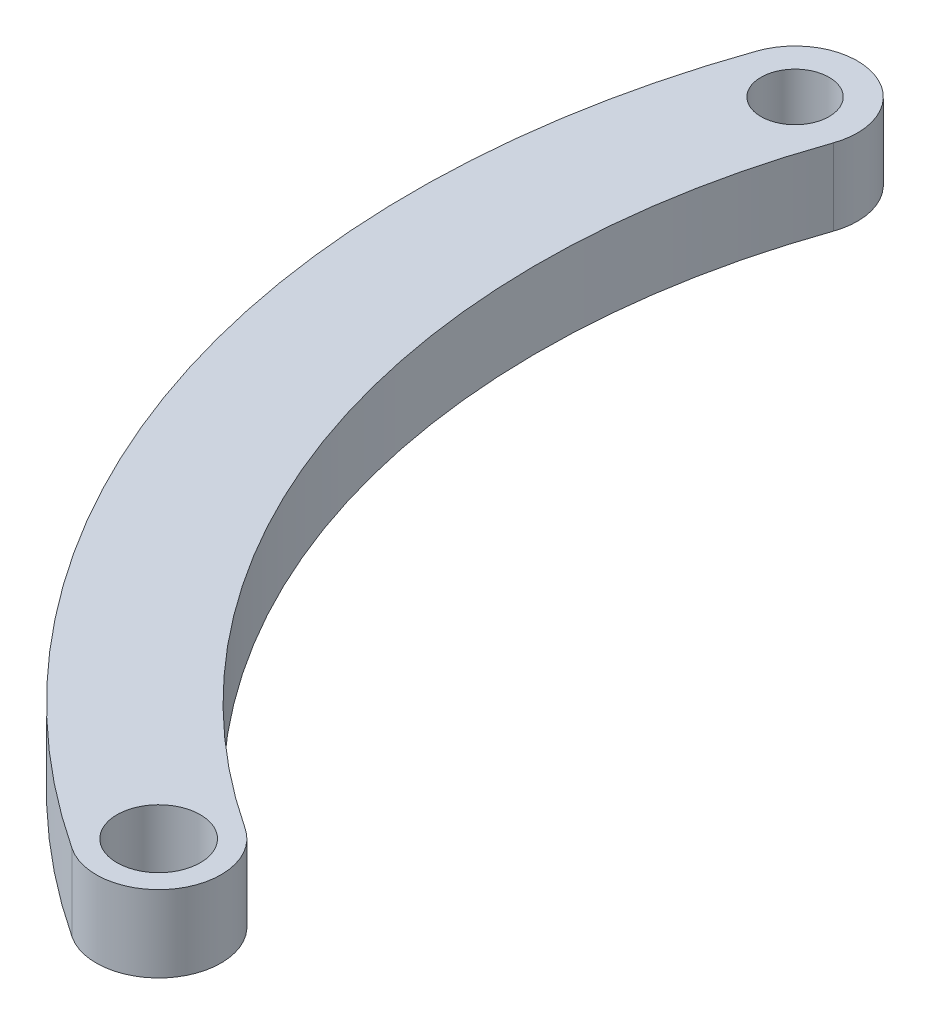
ISO-10303-21;
HEADER;
FILE_DESCRIPTION(('STEP AP214'),'2;1');
FILE_NAME('part.step','',(''),(''),'','','');
FILE_SCHEMA(('AUTOMOTIVE_DESIGN { 1 0 10303 214 1 1 1 1 }'));
ENDSEC;
DATA;
#1=APPLICATION_CONTEXT('core data for automotive mechanical design processes');
#2=APPLICATION_PROTOCOL_DEFINITION('international standard','automotive_design',2000,#1);
#3=PRODUCT_CONTEXT('',#1,'mechanical');
#4=PRODUCT('Part','Part','',(#3));
#5=PRODUCT_RELATED_PRODUCT_CATEGORY('part','',(#4));
#6=PRODUCT_DEFINITION_FORMATION('','',#4);
#7=PRODUCT_DEFINITION_CONTEXT('part definition',#1,'design');
#8=PRODUCT_DEFINITION('design','',#6,#7);
#9=PRODUCT_DEFINITION_SHAPE('','',#8);
#10=(LENGTH_UNIT() NAMED_UNIT(*) SI_UNIT(.MILLI.,.METRE.));
#11=(NAMED_UNIT(*) PLANE_ANGLE_UNIT() SI_UNIT($,.RADIAN.));
#12=(NAMED_UNIT(*) SI_UNIT($,.STERADIAN.) SOLID_ANGLE_UNIT());
#13=UNCERTAINTY_MEASURE_WITH_UNIT(LENGTH_MEASURE(1.E-05),#10,'distance_accuracy_value','');
#14=(GEOMETRIC_REPRESENTATION_CONTEXT(3) GLOBAL_UNCERTAINTY_ASSIGNED_CONTEXT((#13)) GLOBAL_UNIT_ASSIGNED_CONTEXT((#10,
#11,#12)) REPRESENTATION_CONTEXT('',''));
#15=CARTESIAN_POINT('',(0.,0.,0.));
#16=DIRECTION('',(0.,0.,1.));
#17=DIRECTION('',(1.,0.,0.));
#18=AXIS2_PLACEMENT_3D('',#15,#16,#17);
#19=CARTESIAN_POINT('',(-30.4740283959686,6.,-10.6886517508248));
#20=DIRECTION('',(0.,1.,0.));
#21=DIRECTION('',(0.,0.,1.));
#22=AXIS2_PLACEMENT_3D('',#19,#20,#21);
#23=PLANE('',#22);
#24=CARTESIAN_POINT('',(-60.9480567919372,6.,-21.3773035016496));
#25=DIRECTION('',(0.,1.,0.));
#26=DIRECTION('',(0.,0.,1.));
#27=AXIS2_PLACEMENT_3D('',#24,#25,#26);
#28=CIRCLE('',#27,2.67188870642774);
#29=CARTESIAN_POINT('',(-60.9480567919372,6.,-18.7054147952219));
#30=VERTEX_POINT('',#29);
#31=EDGE_CURVE('E100',#30,#30,#28,.T.);
#32=ORIENTED_EDGE('',*,*,#31,.F.);
#33=EDGE_LOOP('',(#32));
#34=FACE_BOUND('',#33,.T.);
#35=CARTESIAN_POINT('',(-60.9480567919372,6.,-21.3773035016496));
#36=DIRECTION('',(0.,1.,0.));
#37=DIRECTION('',(0.,0.,1.));
#38=AXIS2_PLACEMENT_3D('',#35,#36,#37);
#39=CIRCLE('',#38,4.89345326894357);
#40=CARTESIAN_POINT('',(-56.3304055320456,6.,-19.7576795522847));
#41=VERTEX_POINT('',#40);
#42=CARTESIAN_POINT('',(-65.5657080518287,6.,-22.9969274510146));
#43=VERTEX_POINT('',#42);
#44=EDGE_CURVE('E85',#41,#43,#39,.T.);
#45=ORIENTED_EDGE('',*,*,#44,.T.);
#46=CARTESIAN_POINT('',(0.,6.,0.));
#47=DIRECTION('',(0.,1.,0.));
#48=DIRECTION('',(0.,0.,1.));
#49=AXIS2_PLACEMENT_3D('',#46,#47,#48);
#50=CIRCLE('',#49,69.4818015348254);
#51=CARTESIAN_POINT('',(-38.2196310369916,6.,58.0256886897613));
#52=VERTEX_POINT('',#51);
#53=EDGE_CURVE('E80',#43,#52,#50,.T.);
#54=ORIENTED_EDGE('',*,*,#53,.T.);
#55=CARTESIAN_POINT('',(-35.5279049403094,6.,53.9390647144273));
#56=DIRECTION('',(0.,1.,0.));
#57=DIRECTION('',(0.,0.,1.));
#58=AXIS2_PLACEMENT_3D('',#55,#56,#57);
#59=CIRCLE('',#58,4.89345326894357);
#60=CARTESIAN_POINT('',(-32.8361788436272,6.,49.8524407390934));
#61=VERTEX_POINT('',#60);
#62=EDGE_CURVE('E83',#52,#61,#59,.T.);
#63=ORIENTED_EDGE('',*,*,#62,.T.);
#64=CARTESIAN_POINT('',(0.,6.,0.));
#65=DIRECTION('',(0.,-1.,0.));
#66=DIRECTION('',(0.,0.,1.));
#67=AXIS2_PLACEMENT_3D('',#64,#65,#66);
#68=CIRCLE('',#67,59.6948949969383);
#69=EDGE_CURVE('E50',#61,#41,#68,.T.);
#70=ORIENTED_EDGE('',*,*,#69,.T.);
#71=EDGE_LOOP('',(#45,#54,#63,#70));
#72=FACE_BOUND('',#71,.T.);
#73=CARTESIAN_POINT('',(-35.5279049403094,6.,53.9390647144273));
#74=DIRECTION('',(0.,1.,0.));
#75=DIRECTION('',(0.,0.,1.));
#76=AXIS2_PLACEMENT_3D('',#73,#74,#75);
#77=CIRCLE('',#76,3.265770333359);
#78=CARTESIAN_POINT('',(-35.5279049403094,6.,57.2048350477863));
#79=VERTEX_POINT('',#78);
#80=EDGE_CURVE('E115',#79,#79,#77,.T.);
#81=ORIENTED_EDGE('',*,*,#80,.F.);
#82=EDGE_LOOP('',(#81));
#83=FACE_BOUND('',#82,.T.);
#84=ADVANCED_FACE('F33',(#34,#72,#83),#23,.T.);
#85=CARTESIAN_POINT('',(-30.4740283959686,0.,-10.6886517508248));
#86=DIRECTION('',(0.,1.,0.));
#87=DIRECTION('',(0.,0.,1.));
#88=AXIS2_PLACEMENT_3D('',#85,#86,#87);
#89=PLANE('',#88);
#90=CARTESIAN_POINT('',(-60.9480567919372,0.,-21.3773035016496));
#91=DIRECTION('',(0.,1.,0.));
#92=DIRECTION('',(0.,0.,1.));
#93=AXIS2_PLACEMENT_3D('',#90,#91,#92);
#94=CIRCLE('',#93,2.67188870642774);
#95=CARTESIAN_POINT('',(-60.9480567919372,0.,-18.7054147952219));
#96=VERTEX_POINT('',#95);
#97=EDGE_CURVE('E112',#96,#96,#94,.T.);
#98=ORIENTED_EDGE('',*,*,#97,.T.);
#99=EDGE_LOOP('',(#98));
#100=FACE_BOUND('',#99,.T.);
#101=CARTESIAN_POINT('',(-60.9480567919372,0.,-21.3773035016496));
#102=DIRECTION('',(0.,1.,0.));
#103=DIRECTION('',(0.,0.,1.));
#104=AXIS2_PLACEMENT_3D('',#101,#102,#103);
#105=CIRCLE('',#104,4.89345326894357);
#106=CARTESIAN_POINT('',(-56.3304055320456,0.,-19.7576795522847));
#107=VERTEX_POINT('',#106);
#108=CARTESIAN_POINT('',(-65.5657080518287,0.,-22.9969274510146));
#109=VERTEX_POINT('',#108);
#110=EDGE_CURVE('E97',#107,#109,#105,.T.);
#111=ORIENTED_EDGE('',*,*,#110,.F.);
#112=CARTESIAN_POINT('',(0.,0.,0.));
#113=DIRECTION('',(0.,-1.,0.));
#114=DIRECTION('',(0.,0.,1.));
#115=AXIS2_PLACEMENT_3D('',#112,#113,#114);
#116=CIRCLE('',#115,59.6948949969383);
#117=CARTESIAN_POINT('',(-32.8361788436272,0.,49.8524407390934));
#118=VERTEX_POINT('',#117);
#119=EDGE_CURVE('E73',#118,#107,#116,.T.);
#120=ORIENTED_EDGE('',*,*,#119,.F.);
#121=CARTESIAN_POINT('',(-35.5279049403094,0.,53.9390647144273));
#122=DIRECTION('',(0.,1.,0.));
#123=DIRECTION('',(0.,0.,1.));
#124=AXIS2_PLACEMENT_3D('',#121,#122,#123);
#125=CIRCLE('',#124,4.89345326894357);
#126=CARTESIAN_POINT('',(-38.2196310369916,0.,58.0256886897613));
#127=VERTEX_POINT('',#126);
#128=EDGE_CURVE('E67',#127,#118,#125,.T.);
#129=ORIENTED_EDGE('',*,*,#128,.F.);
#130=CARTESIAN_POINT('',(0.,0.,0.));
#131=DIRECTION('',(0.,1.,0.));
#132=DIRECTION('',(0.,0.,1.));
#133=AXIS2_PLACEMENT_3D('',#130,#131,#132);
#134=CIRCLE('',#133,69.4818015348254);
#135=EDGE_CURVE('E89',#109,#127,#134,.T.);
#136=ORIENTED_EDGE('',*,*,#135,.F.);
#137=EDGE_LOOP('',(#111,#120,#129,#136));
#138=FACE_BOUND('',#137,.T.);
#139=CARTESIAN_POINT('',(-35.5279049403094,0.,53.9390647144273));
#140=DIRECTION('',(0.,1.,0.));
#141=DIRECTION('',(0.,0.,1.));
#142=AXIS2_PLACEMENT_3D('',#139,#140,#141);
#143=CIRCLE('',#142,3.265770333359);
#144=CARTESIAN_POINT('',(-35.5279049403094,0.,57.2048350477863));
#145=VERTEX_POINT('',#144);
#146=EDGE_CURVE('E118',#145,#145,#143,.T.);
#147=ORIENTED_EDGE('',*,*,#146,.T.);
#148=EDGE_LOOP('',(#147));
#149=FACE_BOUND('',#148,.T.);
#150=ADVANCED_FACE('F108',(#100,#138,#149),#89,.F.);
#151=CARTESIAN_POINT('',(-60.9480567919372,6.,-21.3773035016496));
#152=DIRECTION('',(0.,-1.,0.));
#153=DIRECTION('',(0.,0.,-1.));
#154=AXIS2_PLACEMENT_3D('',#151,#152,#153);
#155=CYLINDRICAL_SURFACE('',#154,4.89345326894357);
#156=ORIENTED_EDGE('',*,*,#110,.T.);
#157=DIRECTION('',(0.,-1.,0.));
#158=VECTOR('',#157,1.);
#159=CARTESIAN_POINT('',(-65.5657080518287,6.,-22.9969274510146));
#160=LINE('',#159,#158);
#161=EDGE_CURVE('E11',#43,#109,#160,.T.);
#162=ORIENTED_EDGE('',*,*,#161,.F.);
#163=ORIENTED_EDGE('',*,*,#44,.F.);
#164=DIRECTION('',(0.,-1.,0.));
#165=VECTOR('',#164,1.);
#166=CARTESIAN_POINT('',(-56.3304055320456,6.,-19.7576795522847));
#167=LINE('',#166,#165);
#168=EDGE_CURVE('E93',#41,#107,#167,.T.);
#169=ORIENTED_EDGE('',*,*,#168,.T.);
#170=EDGE_LOOP('',(#156,#162,#163,#169));
#171=FACE_BOUND('',#170,.T.);
#172=ADVANCED_FACE('F35',(#171),#155,.T.);
#173=CARTESIAN_POINT('',(0.,6.,0.));
#174=DIRECTION('',(0.,-1.,0.));
#175=DIRECTION('',(0.,0.,-1.));
#176=AXIS2_PLACEMENT_3D('',#173,#174,#175);
#177=CYLINDRICAL_SURFACE('',#176,69.4818015348254);
#178=ORIENTED_EDGE('',*,*,#135,.T.);
#179=DIRECTION('',(0.,-1.,0.));
#180=VECTOR('',#179,1.);
#181=CARTESIAN_POINT('',(-38.2196310369916,6.,58.0256886897613));
#182=LINE('',#181,#180);
#183=EDGE_CURVE('E42',#52,#127,#182,.T.);
#184=ORIENTED_EDGE('',*,*,#183,.F.);
#185=ORIENTED_EDGE('',*,*,#53,.F.);
#186=ORIENTED_EDGE('',*,*,#161,.T.);
#187=EDGE_LOOP('',(#178,#184,#185,#186));
#188=FACE_BOUND('',#187,.T.);
#189=ADVANCED_FACE('F88',(#188),#177,.T.);
#190=CARTESIAN_POINT('',(-35.5279049403094,6.,53.9390647144273));
#191=DIRECTION('',(0.,-1.,0.));
#192=DIRECTION('',(0.,0.,-1.));
#193=AXIS2_PLACEMENT_3D('',#190,#191,#192);
#194=CYLINDRICAL_SURFACE('',#193,4.89345326894357);
#195=ORIENTED_EDGE('',*,*,#128,.T.);
#196=DIRECTION('',(0.,-1.,0.));
#197=VECTOR('',#196,1.);
#198=CARTESIAN_POINT('',(-32.8361788436272,6.,49.8524407390934));
#199=LINE('',#198,#197);
#200=EDGE_CURVE('E90',#61,#118,#199,.T.);
#201=ORIENTED_EDGE('',*,*,#200,.F.);
#202=ORIENTED_EDGE('',*,*,#62,.F.);
#203=ORIENTED_EDGE('',*,*,#183,.T.);
#204=EDGE_LOOP('',(#195,#201,#202,#203));
#205=FACE_BOUND('',#204,.T.);
#206=ADVANCED_FACE('F91',(#205),#194,.T.);
#207=CARTESIAN_POINT('',(0.,6.,0.));
#208=DIRECTION('',(0.,-1.,0.));
#209=DIRECTION('',(0.,0.,-1.));
#210=AXIS2_PLACEMENT_3D('',#207,#208,#209);
#211=CYLINDRICAL_SURFACE('',#210,59.6948949969383);
#212=ORIENTED_EDGE('',*,*,#119,.T.);
#213=ORIENTED_EDGE('',*,*,#168,.F.);
#214=ORIENTED_EDGE('',*,*,#69,.F.);
#215=ORIENTED_EDGE('',*,*,#200,.T.);
#216=EDGE_LOOP('',(#212,#213,#214,#215));
#217=FACE_BOUND('',#216,.T.);
#218=ADVANCED_FACE('F105',(#217),#211,.F.);
#219=CARTESIAN_POINT('',(-60.9480567919372,6.,-21.3773035016496));
#220=DIRECTION('',(0.,-1.,0.));
#221=DIRECTION('',(0.,0.,-1.));
#222=AXIS2_PLACEMENT_3D('',#219,#220,#221);
#223=CYLINDRICAL_SURFACE('',#222,2.67188870642774);
#224=ORIENTED_EDGE('',*,*,#31,.T.);
#225=EDGE_LOOP('',(#224));
#226=FACE_BOUND('',#225,.T.);
#227=ORIENTED_EDGE('',*,*,#97,.F.);
#228=EDGE_LOOP('',(#227));
#229=FACE_BOUND('',#228,.T.);
#230=ADVANCED_FACE('F136',(#226,#229),#223,.F.);
#231=CARTESIAN_POINT('',(-35.5279049403094,6.,53.9390647144273));
#232=DIRECTION('',(0.,-1.,0.));
#233=DIRECTION('',(0.,0.,-1.));
#234=AXIS2_PLACEMENT_3D('',#231,#232,#233);
#235=CYLINDRICAL_SURFACE('',#234,3.265770333359);
#236=ORIENTED_EDGE('',*,*,#80,.T.);
#237=EDGE_LOOP('',(#236));
#238=FACE_BOUND('',#237,.T.);
#239=ORIENTED_EDGE('',*,*,#146,.F.);
#240=EDGE_LOOP('',(#239));
#241=FACE_BOUND('',#240,.T.);
#242=ADVANCED_FACE('F124',(#238,#241),#235,.F.);
#243=CLOSED_SHELL('',(#84,#150,#172,#189,#206,#218,#230,#242));
#244=MANIFOLD_SOLID_BREP('B2',#243);
#245=ADVANCED_BREP_SHAPE_REPRESENTATION('',(#18,#244),#14);
#246=SHAPE_DEFINITION_REPRESENTATION(#9,#245);
ENDSEC;
END-ISO-10303-21;
